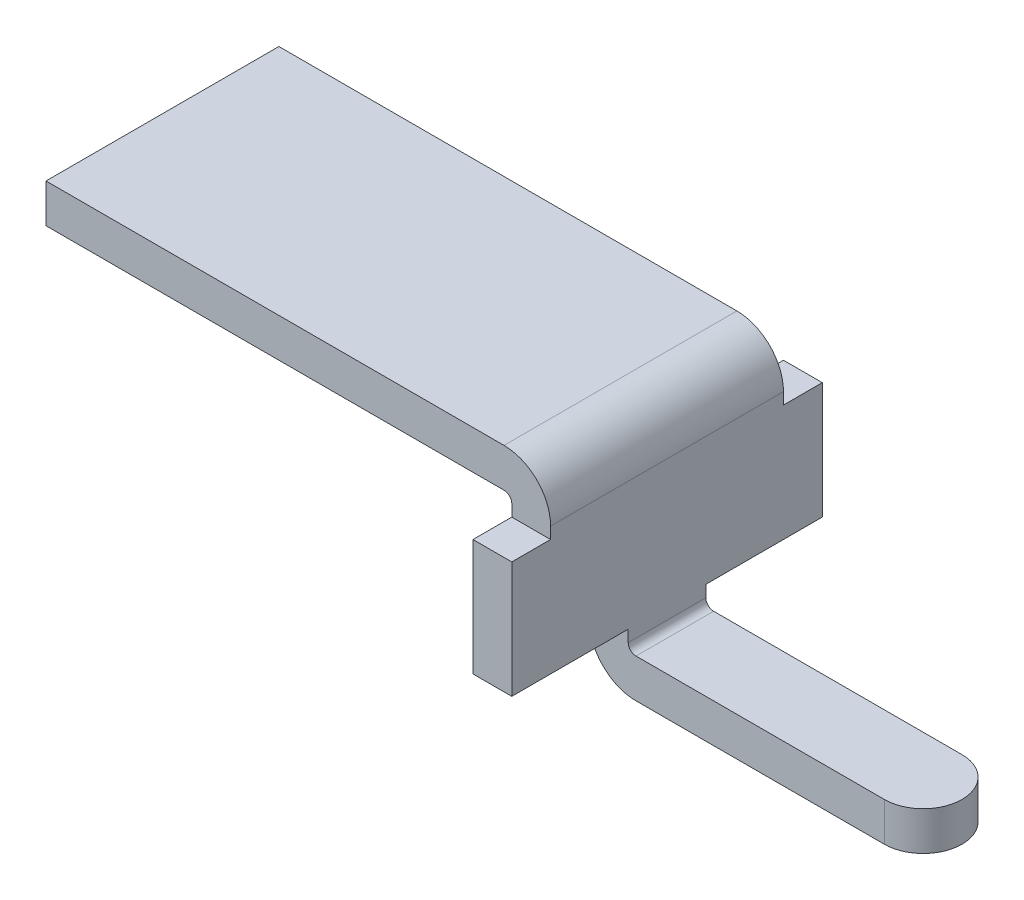
ISO-10303-21;
HEADER;
FILE_DESCRIPTION(('STEP AP214'),'2;1');
FILE_NAME('part.step','',(''),(''),'','','');
FILE_SCHEMA(('AUTOMOTIVE_DESIGN { 1 0 10303 214 1 1 1 1 }'));
ENDSEC;
DATA;
#1=APPLICATION_CONTEXT('core data for automotive mechanical design processes');
#2=APPLICATION_PROTOCOL_DEFINITION('international standard','automotive_design',2000,#1);
#3=PRODUCT_CONTEXT('',#1,'mechanical');
#4=PRODUCT('Part','Part','',(#3));
#5=PRODUCT_RELATED_PRODUCT_CATEGORY('part','',(#4));
#6=PRODUCT_DEFINITION_FORMATION('','',#4);
#7=PRODUCT_DEFINITION_CONTEXT('part definition',#1,'design');
#8=PRODUCT_DEFINITION('design','',#6,#7);
#9=PRODUCT_DEFINITION_SHAPE('','',#8);
#10=(LENGTH_UNIT() NAMED_UNIT(*) SI_UNIT(.MILLI.,.METRE.));
#11=(NAMED_UNIT(*) PLANE_ANGLE_UNIT() SI_UNIT($,.RADIAN.));
#12=(NAMED_UNIT(*) SI_UNIT($,.STERADIAN.) SOLID_ANGLE_UNIT());
#13=UNCERTAINTY_MEASURE_WITH_UNIT(LENGTH_MEASURE(1.E-05),#10,'distance_accuracy_value','');
#14=(GEOMETRIC_REPRESENTATION_CONTEXT(3) GLOBAL_UNCERTAINTY_ASSIGNED_CONTEXT((#13)) GLOBAL_UNIT_ASSIGNED_CONTEXT((#10,
#11,#12)) REPRESENTATION_CONTEXT('',''));
#15=CARTESIAN_POINT('',(0.,0.,0.));
#16=DIRECTION('',(0.,0.,1.));
#17=DIRECTION('',(1.,0.,0.));
#18=AXIS2_PLACEMENT_3D('',#15,#16,#17);
#19=CARTESIAN_POINT('',(6.,-2.5,8.24309069156733));
#20=DIRECTION('',(0.,-1.,0.));
#21=DIRECTION('',(0.,0.,-1.));
#22=AXIS2_PLACEMENT_3D('',#19,#20,#21);
#23=PLANE('',#22);
#24=DIRECTION('',(0.,0.,-1.));
#25=VECTOR('',#24,1.);
#26=CARTESIAN_POINT('',(6.6,-2.5,8.24309069156733));
#27=LINE('',#26,#25);
#28=CARTESIAN_POINT('',(6.6,-2.5,2.));
#29=VERTEX_POINT('',#28);
#30=CARTESIAN_POINT('',(6.6,-2.5,0.999999999999999));
#31=VERTEX_POINT('',#30);
#32=EDGE_CURVE('E298',#29,#31,#27,.T.);
#33=ORIENTED_EDGE('',*,*,#32,.T.);
#34=DIRECTION('',(1.,0.,0.));
#35=VECTOR('',#34,1.);
#36=CARTESIAN_POINT('',(10.3,-2.5,1.));
#37=LINE('',#36,#35);
#38=CARTESIAN_POINT('',(9.8,-2.5,1.));
#39=VERTEX_POINT('',#38);
#40=EDGE_CURVE('E263',#31,#39,#37,.T.);
#41=ORIENTED_EDGE('',*,*,#40,.T.);
#42=CARTESIAN_POINT('',(9.8,-2.5,1.5));
#43=DIRECTION('',(0.,1.,0.));
#44=DIRECTION('',(0.,0.,1.));
#45=AXIS2_PLACEMENT_3D('',#42,#43,#44);
#46=CIRCLE('',#45,0.5);
#47=CARTESIAN_POINT('',(9.8,-2.5,2.));
#48=VERTEX_POINT('',#47);
#49=EDGE_CURVE('E287',#48,#39,#46,.T.);
#50=ORIENTED_EDGE('',*,*,#49,.F.);
#51=DIRECTION('',(-1.,0.,0.));
#52=VECTOR('',#51,1.);
#53=CARTESIAN_POINT('',(10.3,-2.5,2.));
#54=LINE('',#53,#52);
#55=EDGE_CURVE('E288',#48,#29,#54,.T.);
#56=ORIENTED_EDGE('',*,*,#55,.T.);
#57=EDGE_LOOP('',(#33,#41,#50,#56));
#58=FACE_BOUND('',#57,.T.);
#59=ADVANCED_FACE('F16',(#58),#23,.T.);
#60=CARTESIAN_POINT('',(10.3,2.66474801092882,2.));
#61=DIRECTION('',(0.,0.,-1.));
#62=DIRECTION('',(-1.,0.,0.));
#63=AXIS2_PLACEMENT_3D('',#60,#61,#62);
#64=PLANE('',#63);
#65=DIRECTION('',(0.,1.,0.));
#66=VECTOR('',#65,1.);
#67=CARTESIAN_POINT('',(9.8,-2.5,2.));
#68=LINE('',#67,#66);
#69=CARTESIAN_POINT('',(9.8,-2.,2.));
#70=VERTEX_POINT('',#69);
#71=EDGE_CURVE('E284',#70,#48,#68,.F.);
#72=ORIENTED_EDGE('',*,*,#71,.F.);
#73=DIRECTION('',(-1.,0.,0.));
#74=VECTOR('',#73,1.);
#75=CARTESIAN_POINT('',(6.5,-2.,2.));
#76=LINE('',#75,#74);
#77=CARTESIAN_POINT('',(6.6,-2.,2.));
#78=VERTEX_POINT('',#77);
#79=EDGE_CURVE('E251',#78,#70,#76,.F.);
#80=ORIENTED_EDGE('',*,*,#79,.F.);
#81=CARTESIAN_POINT('',(6.6,-1.9,2.));
#82=DIRECTION('',(0.,0.,1.));
#83=DIRECTION('',(1.,0.,0.));
#84=AXIS2_PLACEMENT_3D('',#81,#82,#83);
#85=CIRCLE('',#84,0.1);
#86=CARTESIAN_POINT('',(6.5,-1.9,2.));
#87=VERTEX_POINT('',#86);
#88=EDGE_CURVE('E19',#87,#78,#85,.T.);
#89=ORIENTED_EDGE('',*,*,#88,.F.);
#90=DIRECTION('',(0.,1.,0.));
#91=VECTOR('',#90,1.);
#92=CARTESIAN_POINT('',(6.5,2.66474801092882,2.));
#93=LINE('',#92,#91);
#94=CARTESIAN_POINT('',(6.5,-1.75,2.));
#95=VERTEX_POINT('',#94);
#96=EDGE_CURVE('E108',#95,#87,#93,.F.);
#97=ORIENTED_EDGE('',*,*,#96,.F.);
#98=DIRECTION('',(-1.,0.,0.));
#99=VECTOR('',#98,1.);
#100=CARTESIAN_POINT('',(10.3,-1.75,2.));
#101=LINE('',#100,#99);
#102=CARTESIAN_POINT('',(6.,-1.75,2.));
#103=VERTEX_POINT('',#102);
#104=EDGE_CURVE('E292',#103,#95,#101,.F.);
#105=ORIENTED_EDGE('',*,*,#104,.F.);
#106=DIRECTION('',(0.,1.,0.));
#107=VECTOR('',#106,1.);
#108=CARTESIAN_POINT('',(6.,2.66474801092882,2.));
#109=LINE('',#108,#107);
#110=CARTESIAN_POINT('',(6.,-1.9,2.));
#111=VERTEX_POINT('',#110);
#112=EDGE_CURVE('E295',#111,#103,#109,.T.);
#113=ORIENTED_EDGE('',*,*,#112,.F.);
#114=CARTESIAN_POINT('',(6.6,-1.9,2.));
#115=DIRECTION('',(0.,0.,-1.));
#116=DIRECTION('',(-1.,0.,0.));
#117=AXIS2_PLACEMENT_3D('',#114,#115,#116);
#118=CIRCLE('',#117,0.6);
#119=EDGE_CURVE('E280',#29,#111,#118,.T.);
#120=ORIENTED_EDGE('',*,*,#119,.F.);
#121=ORIENTED_EDGE('',*,*,#55,.F.);
#122=EDGE_LOOP('',(#72,#80,#89,#97,#105,#113,#120,#121));
#123=FACE_BOUND('',#122,.T.);
#124=ADVANCED_FACE('F364',(#123),#64,.F.);
#125=CARTESIAN_POINT('',(9.8,2.66474801092882,1.5));
#126=DIRECTION('',(0.,1.,0.));
#127=DIRECTION('',(0.,0.,1.));
#128=AXIS2_PLACEMENT_3D('',#125,#126,#127);
#129=CYLINDRICAL_SURFACE('',#128,0.5);
#130=CARTESIAN_POINT('',(9.8,-2.,1.5));
#131=DIRECTION('',(0.,1.,0.));
#132=DIRECTION('',(0.,0.,1.));
#133=AXIS2_PLACEMENT_3D('',#130,#131,#132);
#134=CIRCLE('',#133,0.5);
#135=CARTESIAN_POINT('',(9.8,-2.,1.));
#136=VERTEX_POINT('',#135);
#137=EDGE_CURVE('E250',#70,#136,#134,.T.);
#138=ORIENTED_EDGE('',*,*,#137,.F.);
#139=ORIENTED_EDGE('',*,*,#71,.T.);
#140=ORIENTED_EDGE('',*,*,#49,.T.);
#141=DIRECTION('',(0.,1.,0.));
#142=VECTOR('',#141,1.);
#143=CARTESIAN_POINT('',(9.8,2.66474801092882,1.));
#144=LINE('',#143,#142);
#145=EDGE_CURVE('E266',#39,#136,#144,.T.);
#146=ORIENTED_EDGE('',*,*,#145,.T.);
#147=EDGE_LOOP('',(#138,#139,#140,#146));
#148=FACE_BOUND('',#147,.T.);
#149=ADVANCED_FACE('F338',(#148),#129,.T.);
#150=CARTESIAN_POINT('',(10.3,2.66474801092882,1.));
#151=DIRECTION('',(0.,0.,1.));
#152=DIRECTION('',(1.,0.,0.));
#153=AXIS2_PLACEMENT_3D('',#150,#151,#152);
#154=PLANE('',#153);
#155=ORIENTED_EDGE('',*,*,#145,.F.);
#156=ORIENTED_EDGE('',*,*,#40,.F.);
#157=CARTESIAN_POINT('',(6.6,-1.9,0.999999999999999));
#158=DIRECTION('',(0.,0.,-1.));
#159=DIRECTION('',(-1.,0.,0.));
#160=AXIS2_PLACEMENT_3D('',#157,#158,#159);
#161=CIRCLE('',#160,0.6);
#162=CARTESIAN_POINT('',(6.,-1.9,0.999999999999999));
#163=VERTEX_POINT('',#162);
#164=EDGE_CURVE('E254',#163,#31,#161,.F.);
#165=ORIENTED_EDGE('',*,*,#164,.F.);
#166=DIRECTION('',(0.,1.,0.));
#167=VECTOR('',#166,1.);
#168=CARTESIAN_POINT('',(6.,2.66474801092882,0.999999999999999));
#169=LINE('',#168,#167);
#170=CARTESIAN_POINT('',(6.,-1.75,0.999999999999999));
#171=VERTEX_POINT('',#170);
#172=EDGE_CURVE('E267',#171,#163,#169,.F.);
#173=ORIENTED_EDGE('',*,*,#172,.F.);
#174=DIRECTION('',(1.,0.,0.));
#175=VECTOR('',#174,1.);
#176=CARTESIAN_POINT('',(10.3,-1.75,1.));
#177=LINE('',#176,#175);
#178=CARTESIAN_POINT('',(6.5,-1.75,0.999999999999999));
#179=VERTEX_POINT('',#178);
#180=EDGE_CURVE('E269',#179,#171,#177,.F.);
#181=ORIENTED_EDGE('',*,*,#180,.F.);
#182=DIRECTION('',(0.,1.,0.));
#183=VECTOR('',#182,1.);
#184=CARTESIAN_POINT('',(6.5,2.66474801092882,0.999999999999999));
#185=LINE('',#184,#183);
#186=CARTESIAN_POINT('',(6.5,-1.9,0.999999999999999));
#187=VERTEX_POINT('',#186);
#188=EDGE_CURVE('E272',#187,#179,#185,.T.);
#189=ORIENTED_EDGE('',*,*,#188,.F.);
#190=CARTESIAN_POINT('',(6.6,-1.9,0.999999999999999));
#191=DIRECTION('',(0.,0.,1.));
#192=DIRECTION('',(1.,0.,0.));
#193=AXIS2_PLACEMENT_3D('',#190,#191,#192);
#194=CIRCLE('',#193,0.1);
#195=CARTESIAN_POINT('',(6.6,-2.,0.999999999999999));
#196=VERTEX_POINT('',#195);
#197=EDGE_CURVE('E275',#196,#187,#194,.F.);
#198=ORIENTED_EDGE('',*,*,#197,.F.);
#199=DIRECTION('',(-1.,0.,0.));
#200=VECTOR('',#199,1.);
#201=CARTESIAN_POINT('',(6.5,-2.,0.999999999999999));
#202=LINE('',#201,#200);
#203=EDGE_CURVE('E247',#136,#196,#202,.T.);
#204=ORIENTED_EDGE('',*,*,#203,.F.);
#205=EDGE_LOOP('',(#155,#156,#165,#173,#181,#189,#198,#204));
#206=FACE_BOUND('',#205,.T.);
#207=ADVANCED_FACE('F345',(#206),#154,.F.);
#208=CARTESIAN_POINT('',(6.6,-1.9,8.24309069156733));
#209=DIRECTION('',(0.,0.,-1.));
#210=DIRECTION('',(-1.,0.,0.));
#211=AXIS2_PLACEMENT_3D('',#208,#209,#210);
#212=CYLINDRICAL_SURFACE('',#211,0.6);
#213=ORIENTED_EDGE('',*,*,#164,.T.);
#214=ORIENTED_EDGE('',*,*,#32,.F.);
#215=ORIENTED_EDGE('',*,*,#119,.T.);
#216=DIRECTION('',(0.,0.,1.));
#217=VECTOR('',#216,1.);
#218=CARTESIAN_POINT('',(6.,-1.9,8.24309069156733));
#219=LINE('',#218,#217);
#220=EDGE_CURVE('E244',#163,#111,#219,.T.);
#221=ORIENTED_EDGE('',*,*,#220,.F.);
#222=EDGE_LOOP('',(#213,#214,#215,#221));
#223=FACE_BOUND('',#222,.T.);
#224=ADVANCED_FACE('F349',(#223),#212,.T.);
#225=CARTESIAN_POINT('',(6.5,-2.,8.24309069156733));
#226=DIRECTION('',(0.,1.,0.));
#227=DIRECTION('',(-1.,0.,0.));
#228=AXIS2_PLACEMENT_3D('',#225,#226,#227);
#229=PLANE('',#228);
#230=ORIENTED_EDGE('',*,*,#203,.T.);
#231=DIRECTION('',(0.,0.,1.));
#232=VECTOR('',#231,1.);
#233=CARTESIAN_POINT('',(6.6,-2.,8.24309069156733));
#234=LINE('',#233,#232);
#235=EDGE_CURVE('E240',#196,#78,#234,.T.);
#236=ORIENTED_EDGE('',*,*,#235,.T.);
#237=ORIENTED_EDGE('',*,*,#79,.T.);
#238=ORIENTED_EDGE('',*,*,#137,.T.);
#239=EDGE_LOOP('',(#230,#236,#237,#238));
#240=FACE_BOUND('',#239,.T.);
#241=ADVANCED_FACE('F362',(#240),#229,.T.);
#242=CARTESIAN_POINT('',(6.,0.5,8.24309069156733));
#243=DIRECTION('',(-1.,0.,0.));
#244=DIRECTION('',(0.,0.,1.));
#245=AXIS2_PLACEMENT_3D('',#242,#243,#244);
#246=PLANE('',#245);
#247=ORIENTED_EDGE('',*,*,#172,.T.);
#248=ORIENTED_EDGE('',*,*,#220,.T.);
#249=ORIENTED_EDGE('',*,*,#112,.T.);
#250=DIRECTION('',(0.,0.,1.));
#251=VECTOR('',#250,1.);
#252=CARTESIAN_POINT('',(6.,-1.75,3.5));
#253=LINE('',#252,#251);
#254=CARTESIAN_POINT('',(6.,-1.75,3.5));
#255=VERTEX_POINT('',#254);
#256=EDGE_CURVE('E283',#103,#255,#253,.T.);
#257=ORIENTED_EDGE('',*,*,#256,.T.);
#258=DIRECTION('',(0.,1.,0.));
#259=VECTOR('',#258,1.);
#260=CARTESIAN_POINT('',(6.,0.,3.5));
#261=LINE('',#260,#259);
#262=CARTESIAN_POINT('',(6.,-0.250000000000001,3.5));
#263=VERTEX_POINT('',#262);
#264=EDGE_CURVE('E213',#263,#255,#261,.F.);
#265=ORIENTED_EDGE('',*,*,#264,.F.);
#266=DIRECTION('',(0.,0.,1.));
#267=VECTOR('',#266,1.);
#268=CARTESIAN_POINT('',(6.,-0.250000000000001,8.24309069156733));
#269=LINE('',#268,#267);
#270=CARTESIAN_POINT('',(6.,-0.250000000000001,3.));
#271=VERTEX_POINT('',#270);
#272=EDGE_CURVE('E163',#263,#271,#269,.F.);
#273=ORIENTED_EDGE('',*,*,#272,.T.);
#274=DIRECTION('',(0.,1.,0.));
#275=VECTOR('',#274,1.);
#276=CARTESIAN_POINT('',(6.,0.5,3.));
#277=LINE('',#276,#275);
#278=CARTESIAN_POINT('',(6.,-0.1,3.));
#279=VERTEX_POINT('',#278);
#280=EDGE_CURVE('E229',#271,#279,#277,.T.);
#281=ORIENTED_EDGE('',*,*,#280,.T.);
#282=DIRECTION('',(0.,0.,-1.));
#283=VECTOR('',#282,1.);
#284=CARTESIAN_POINT('',(6.,-0.1,8.24309069156733));
#285=LINE('',#284,#283);
#286=CARTESIAN_POINT('',(6.,-0.1,0.));
#287=VERTEX_POINT('',#286);
#288=EDGE_CURVE('E166',#279,#287,#285,.T.);
#289=ORIENTED_EDGE('',*,*,#288,.T.);
#290=DIRECTION('',(0.,1.,0.));
#291=VECTOR('',#290,1.);
#292=CARTESIAN_POINT('',(6.,0.5,0.));
#293=LINE('',#292,#291);
#294=CARTESIAN_POINT('',(6.,-0.250000000000001,0.));
#295=VERTEX_POINT('',#294);
#296=EDGE_CURVE('E231',#287,#295,#293,.F.);
#297=ORIENTED_EDGE('',*,*,#296,.T.);
#298=DIRECTION('',(0.,0.,1.));
#299=VECTOR('',#298,1.);
#300=CARTESIAN_POINT('',(6.,-0.250000000000001,8.24309069156733));
#301=LINE('',#300,#299);
#302=CARTESIAN_POINT('',(6.,-0.250000000000001,-0.5));
#303=VERTEX_POINT('',#302);
#304=EDGE_CURVE('E235',#295,#303,#301,.F.);
#305=ORIENTED_EDGE('',*,*,#304,.T.);
#306=DIRECTION('',(0.,1.,0.));
#307=VECTOR('',#306,1.);
#308=CARTESIAN_POINT('',(6.,0.,-0.5));
#309=LINE('',#308,#307);
#310=CARTESIAN_POINT('',(6.,-1.75,-0.5));
#311=VERTEX_POINT('',#310);
#312=EDGE_CURVE('E214',#303,#311,#309,.F.);
#313=ORIENTED_EDGE('',*,*,#312,.T.);
#314=DIRECTION('',(0.,0.,1.));
#315=VECTOR('',#314,1.);
#316=CARTESIAN_POINT('',(6.,-1.75,-0.5));
#317=LINE('',#316,#315);
#318=EDGE_CURVE('E223',#311,#171,#317,.T.);
#319=ORIENTED_EDGE('',*,*,#318,.T.);
#320=EDGE_LOOP('',(#247,#248,#249,#257,#265,#273,#281,#289,#297,#305,#313,#319));
#321=FACE_BOUND('',#320,.T.);
#322=ADVANCED_FACE('F353',(#321),#246,.T.);
#323=CARTESIAN_POINT('',(6.,-1.75,3.5));
#324=DIRECTION('',(0.,1.,0.));
#325=DIRECTION('',(0.,0.,1.));
#326=AXIS2_PLACEMENT_3D('',#323,#324,#325);
#327=PLANE('',#326);
#328=ORIENTED_EDGE('',*,*,#104,.T.);
#329=DIRECTION('',(0.,0.,-1.));
#330=VECTOR('',#329,1.);
#331=CARTESIAN_POINT('',(6.5,-1.75,8.24309069156733));
#332=LINE('',#331,#330);
#333=CARTESIAN_POINT('',(6.5,-1.75,3.5));
#334=VERTEX_POINT('',#333);
#335=EDGE_CURVE('E200',#334,#95,#332,.T.);
#336=ORIENTED_EDGE('',*,*,#335,.F.);
#337=DIRECTION('',(1.,0.,0.));
#338=VECTOR('',#337,1.);
#339=CARTESIAN_POINT('',(0.,-1.75,3.5));
#340=LINE('',#339,#338);
#341=EDGE_CURVE('E167',#255,#334,#340,.T.);
#342=ORIENTED_EDGE('',*,*,#341,.F.);
#343=ORIENTED_EDGE('',*,*,#256,.F.);
#344=EDGE_LOOP('',(#328,#336,#342,#343));
#345=FACE_BOUND('',#344,.T.);
#346=ADVANCED_FACE('F367',(#345),#327,.F.);
#347=CARTESIAN_POINT('',(6.6,-1.9,8.24309069156733));
#348=DIRECTION('',(0.,0.,1.));
#349=DIRECTION('',(1.,0.,0.));
#350=AXIS2_PLACEMENT_3D('',#347,#348,#349);
#351=CYLINDRICAL_SURFACE('',#350,0.1);
#352=ORIENTED_EDGE('',*,*,#88,.T.);
#353=ORIENTED_EDGE('',*,*,#235,.F.);
#354=ORIENTED_EDGE('',*,*,#197,.T.);
#355=DIRECTION('',(0.,0.,-1.));
#356=VECTOR('',#355,1.);
#357=CARTESIAN_POINT('',(6.5,-1.9,8.24309069156733));
#358=LINE('',#357,#356);
#359=EDGE_CURVE('E218',#87,#187,#358,.T.);
#360=ORIENTED_EDGE('',*,*,#359,.F.);
#361=EDGE_LOOP('',(#352,#353,#354,#360));
#362=FACE_BOUND('',#361,.T.);
#363=ADVANCED_FACE('F363',(#362),#351,.F.);
#364=CARTESIAN_POINT('',(6.5,-1.75,-0.5));
#365=DIRECTION('',(0.,1.,0.));
#366=DIRECTION('',(0.,0.,1.));
#367=AXIS2_PLACEMENT_3D('',#364,#365,#366);
#368=PLANE('',#367);
#369=ORIENTED_EDGE('',*,*,#180,.T.);
#370=ORIENTED_EDGE('',*,*,#318,.F.);
#371=DIRECTION('',(1.,0.,0.));
#372=VECTOR('',#371,1.);
#373=CARTESIAN_POINT('',(0.,-1.75,-0.5));
#374=LINE('',#373,#372);
#375=CARTESIAN_POINT('',(6.5,-1.75,-0.5));
#376=VERTEX_POINT('',#375);
#377=EDGE_CURVE('E210',#311,#376,#374,.T.);
#378=ORIENTED_EDGE('',*,*,#377,.T.);
#379=DIRECTION('',(0.,0.,-1.));
#380=VECTOR('',#379,1.);
#381=CARTESIAN_POINT('',(6.5,-1.75,8.24309069156733));
#382=LINE('',#381,#380);
#383=EDGE_CURVE('E207',#179,#376,#382,.T.);
#384=ORIENTED_EDGE('',*,*,#383,.F.);
#385=EDGE_LOOP('',(#369,#370,#378,#384));
#386=FACE_BOUND('',#385,.T.);
#387=ADVANCED_FACE('F357',(#386),#368,.F.);
#388=CARTESIAN_POINT('',(0.,0.,-0.5));
#389=DIRECTION('',(0.,0.,1.));
#390=DIRECTION('',(1.,0.,0.));
#391=AXIS2_PLACEMENT_3D('',#388,#389,#390);
#392=PLANE('',#391);
#393=ORIENTED_EDGE('',*,*,#377,.F.);
#394=ORIENTED_EDGE('',*,*,#312,.F.);
#395=DIRECTION('',(1.,0.,0.));
#396=VECTOR('',#395,1.);
#397=CARTESIAN_POINT('',(6.5,-0.250000000000001,-0.5));
#398=LINE('',#397,#396);
#399=CARTESIAN_POINT('',(6.5,-0.250000000000001,-0.5));
#400=VERTEX_POINT('',#399);
#401=EDGE_CURVE('E197',#303,#400,#398,.T.);
#402=ORIENTED_EDGE('',*,*,#401,.T.);
#403=DIRECTION('',(0.,1.,0.));
#404=VECTOR('',#403,1.);
#405=CARTESIAN_POINT('',(6.5,0.5,-0.5));
#406=LINE('',#405,#404);
#407=EDGE_CURVE('E204',#376,#400,#406,.T.);
#408=ORIENTED_EDGE('',*,*,#407,.F.);
#409=EDGE_LOOP('',(#393,#394,#402,#408));
#410=FACE_BOUND('',#409,.T.);
#411=ADVANCED_FACE('F418',(#410),#392,.F.);
#412=CARTESIAN_POINT('',(0.,0.,3.5));
#413=DIRECTION('',(0.,0.,1.));
#414=DIRECTION('',(1.,0.,0.));
#415=AXIS2_PLACEMENT_3D('',#412,#413,#414);
#416=PLANE('',#415);
#417=DIRECTION('',(0.,1.,0.));
#418=VECTOR('',#417,1.);
#419=CARTESIAN_POINT('',(6.5,0.5,3.5));
#420=LINE('',#419,#418);
#421=CARTESIAN_POINT('',(6.5,-0.250000000000001,3.5));
#422=VERTEX_POINT('',#421);
#423=EDGE_CURVE('E170',#422,#334,#420,.F.);
#424=ORIENTED_EDGE('',*,*,#423,.F.);
#425=DIRECTION('',(1.,0.,0.));
#426=VECTOR('',#425,1.);
#427=CARTESIAN_POINT('',(0.,-0.250000000000001,3.5));
#428=LINE('',#427,#426);
#429=EDGE_CURVE('E156',#422,#263,#428,.F.);
#430=ORIENTED_EDGE('',*,*,#429,.T.);
#431=ORIENTED_EDGE('',*,*,#264,.T.);
#432=ORIENTED_EDGE('',*,*,#341,.T.);
#433=EDGE_LOOP('',(#424,#430,#431,#432));
#434=FACE_BOUND('',#433,.T.);
#435=ADVANCED_FACE('F171',(#434),#416,.T.);
#436=CARTESIAN_POINT('',(5.9,-0.1,8.24309069156733));
#437=DIRECTION('',(0.,0.,-1.));
#438=DIRECTION('',(-1.,0.,0.));
#439=AXIS2_PLACEMENT_3D('',#436,#437,#438);
#440=CYLINDRICAL_SURFACE('',#439,0.1);
#441=DIRECTION('',(0.,0.,1.));
#442=VECTOR('',#441,1.);
#443=CARTESIAN_POINT('',(5.9,0.,3.));
#444=LINE('',#443,#442);
#445=CARTESIAN_POINT('',(5.9,0.,3.));
#446=VERTEX_POINT('',#445);
#447=CARTESIAN_POINT('',(5.9,0.,0.));
#448=VERTEX_POINT('',#447);
#449=EDGE_CURVE('E175',#446,#448,#444,.F.);
#450=ORIENTED_EDGE('',*,*,#449,.T.);
#451=CARTESIAN_POINT('',(5.9,-0.1,0.));
#452=DIRECTION('',(0.,0.,-1.));
#453=DIRECTION('',(-1.,0.,0.));
#454=AXIS2_PLACEMENT_3D('',#451,#452,#453);
#455=CIRCLE('',#454,0.1);
#456=EDGE_CURVE('E228',#287,#448,#455,.F.);
#457=ORIENTED_EDGE('',*,*,#456,.F.);
#458=ORIENTED_EDGE('',*,*,#288,.F.);
#459=CARTESIAN_POINT('',(5.9,-0.1,3.));
#460=DIRECTION('',(0.,0.,-1.));
#461=DIRECTION('',(-1.,0.,0.));
#462=AXIS2_PLACEMENT_3D('',#459,#460,#461);
#463=CIRCLE('',#462,0.1);
#464=EDGE_CURVE('E201',#446,#279,#463,.T.);
#465=ORIENTED_EDGE('',*,*,#464,.F.);
#466=EDGE_LOOP('',(#450,#457,#458,#465));
#467=FACE_BOUND('',#466,.T.);
#468=ADVANCED_FACE('F411',(#467),#440,.F.);
#469=CARTESIAN_POINT('',(6.5,-0.250000000000001,-0.5));
#470=DIRECTION('',(0.,-1.,0.));
#471=DIRECTION('',(0.,0.,-1.));
#472=AXIS2_PLACEMENT_3D('',#469,#470,#471);
#473=PLANE('',#472);
#474=DIRECTION('',(0.,0.,-1.));
#475=VECTOR('',#474,1.);
#476=CARTESIAN_POINT('',(6.5,-0.250000000000001,8.24309069156733));
#477=LINE('',#476,#475);
#478=CARTESIAN_POINT('',(6.5,-0.250000000000001,0.));
#479=VERTEX_POINT('',#478);
#480=EDGE_CURVE('E206',#400,#479,#477,.F.);
#481=ORIENTED_EDGE('',*,*,#480,.F.);
#482=ORIENTED_EDGE('',*,*,#401,.F.);
#483=ORIENTED_EDGE('',*,*,#304,.F.);
#484=DIRECTION('',(-1.,0.,0.));
#485=VECTOR('',#484,1.);
#486=CARTESIAN_POINT('',(0.,-0.250000000000001,0.));
#487=LINE('',#486,#485);
#488=EDGE_CURVE('E183',#479,#295,#487,.T.);
#489=ORIENTED_EDGE('',*,*,#488,.F.);
#490=EDGE_LOOP('',(#481,#482,#483,#489));
#491=FACE_BOUND('',#490,.T.);
#492=ADVANCED_FACE('F408',(#491),#473,.F.);
#493=CARTESIAN_POINT('',(6.5,0.5,8.24309069156733));
#494=DIRECTION('',(1.,0.,0.));
#495=DIRECTION('',(0.,0.,-1.));
#496=AXIS2_PLACEMENT_3D('',#493,#494,#495);
#497=PLANE('',#496);
#498=DIRECTION('',(0.,0.,-1.));
#499=VECTOR('',#498,1.);
#500=CARTESIAN_POINT('',(6.5,-0.250000000000001,3.5));
#501=LINE('',#500,#499);
#502=CARTESIAN_POINT('',(6.5,-0.250000000000001,3.));
#503=VERTEX_POINT('',#502);
#504=EDGE_CURVE('E161',#503,#422,#501,.F.);
#505=ORIENTED_EDGE('',*,*,#504,.T.);
#506=ORIENTED_EDGE('',*,*,#423,.T.);
#507=ORIENTED_EDGE('',*,*,#335,.T.);
#508=ORIENTED_EDGE('',*,*,#96,.T.);
#509=ORIENTED_EDGE('',*,*,#359,.T.);
#510=ORIENTED_EDGE('',*,*,#188,.T.);
#511=ORIENTED_EDGE('',*,*,#383,.T.);
#512=ORIENTED_EDGE('',*,*,#407,.T.);
#513=ORIENTED_EDGE('',*,*,#480,.T.);
#514=DIRECTION('',(0.,1.,0.));
#515=VECTOR('',#514,1.);
#516=CARTESIAN_POINT('',(6.5,0.,0.));
#517=LINE('',#516,#515);
#518=CARTESIAN_POINT('',(6.5,-0.0999999999999999,0.));
#519=VERTEX_POINT('',#518);
#520=EDGE_CURVE('E603',#519,#479,#517,.F.);
#521=ORIENTED_EDGE('',*,*,#520,.F.);
#522=DIRECTION('',(0.,0.,1.));
#523=VECTOR('',#522,1.);
#524=CARTESIAN_POINT('',(6.5,-0.0999999999999999,3.));
#525=LINE('',#524,#523);
#526=CARTESIAN_POINT('',(6.5,-0.0999999999999999,3.));
#527=VERTEX_POINT('',#526);
#528=EDGE_CURVE('E326',#527,#519,#525,.F.);
#529=ORIENTED_EDGE('',*,*,#528,.F.);
#530=DIRECTION('',(0.,1.,0.));
#531=VECTOR('',#530,1.);
#532=CARTESIAN_POINT('',(6.5,0.5,3.));
#533=LINE('',#532,#531);
#534=EDGE_CURVE('E176',#527,#503,#533,.F.);
#535=ORIENTED_EDGE('',*,*,#534,.T.);
#536=EDGE_LOOP('',(#505,#506,#507,#508,#509,#510,#511,#512,#513,#521,#529,#535));
#537=FACE_BOUND('',#536,.T.);
#538=ADVANCED_FACE('F178',(#537),#497,.T.);
#539=CARTESIAN_POINT('',(0.,0.,3.));
#540=DIRECTION('',(0.,1.,0.));
#541=DIRECTION('',(0.,0.,1.));
#542=AXIS2_PLACEMENT_3D('',#539,#540,#541);
#543=PLANE('',#542);
#544=ORIENTED_EDGE('',*,*,#449,.F.);
#545=DIRECTION('',(-1.,0.,0.));
#546=VECTOR('',#545,1.);
#547=CARTESIAN_POINT('',(0.,0.,3.));
#548=LINE('',#547,#546);
#549=CARTESIAN_POINT('',(0.,0.,3.));
#550=VERTEX_POINT('',#549);
#551=EDGE_CURVE('E325',#446,#550,#548,.T.);
#552=ORIENTED_EDGE('',*,*,#551,.T.);
#553=DIRECTION('',(0.,0.,-1.));
#554=VECTOR('',#553,1.);
#555=CARTESIAN_POINT('',(0.,0.,3.));
#556=LINE('',#555,#554);
#557=CARTESIAN_POINT('',(0.,0.,0.));
#558=VERTEX_POINT('',#557);
#559=EDGE_CURVE('E180',#550,#558,#556,.T.);
#560=ORIENTED_EDGE('',*,*,#559,.T.);
#561=DIRECTION('',(-1.,0.,0.));
#562=VECTOR('',#561,1.);
#563=CARTESIAN_POINT('',(0.,0.,0.));
#564=LINE('',#563,#562);
#565=EDGE_CURVE('E612',#448,#558,#564,.T.);
#566=ORIENTED_EDGE('',*,*,#565,.F.);
#567=EDGE_LOOP('',(#544,#552,#560,#566));
#568=FACE_BOUND('',#567,.T.);
#569=ADVANCED_FACE('F402',(#568),#543,.F.);
#570=CARTESIAN_POINT('',(6.,-0.250000000000001,3.5));
#571=DIRECTION('',(0.,-1.,0.));
#572=DIRECTION('',(0.,0.,-1.));
#573=AXIS2_PLACEMENT_3D('',#570,#571,#572);
#574=PLANE('',#573);
#575=ORIENTED_EDGE('',*,*,#272,.F.);
#576=ORIENTED_EDGE('',*,*,#429,.F.);
#577=ORIENTED_EDGE('',*,*,#504,.F.);
#578=DIRECTION('',(-1.,0.,0.));
#579=VECTOR('',#578,1.);
#580=CARTESIAN_POINT('',(0.,-0.250000000000001,3.));
#581=LINE('',#580,#579);
#582=EDGE_CURVE('E192',#503,#271,#581,.T.);
#583=ORIENTED_EDGE('',*,*,#582,.T.);
#584=EDGE_LOOP('',(#575,#576,#577,#583));
#585=FACE_BOUND('',#584,.T.);
#586=ADVANCED_FACE('F158',(#585),#574,.F.);
#587=CARTESIAN_POINT('',(0.,0.,3.));
#588=DIRECTION('',(1.,0.,0.));
#589=DIRECTION('',(0.,0.,-1.));
#590=AXIS2_PLACEMENT_3D('',#587,#588,#589);
#591=PLANE('',#590);
#592=ORIENTED_EDGE('',*,*,#559,.F.);
#593=DIRECTION('',(0.,1.,0.));
#594=VECTOR('',#593,1.);
#595=CARTESIAN_POINT('',(0.,0.,3.));
#596=LINE('',#595,#594);
#597=CARTESIAN_POINT('',(0.,0.5,3.));
#598=VERTEX_POINT('',#597);
#599=EDGE_CURVE('E322',#550,#598,#596,.T.);
#600=ORIENTED_EDGE('',*,*,#599,.T.);
#601=DIRECTION('',(0.,0.,-1.));
#602=VECTOR('',#601,1.);
#603=CARTESIAN_POINT('',(0.,0.5,3.));
#604=LINE('',#603,#602);
#605=CARTESIAN_POINT('',(0.,0.5,0.));
#606=VERTEX_POINT('',#605);
#607=EDGE_CURVE('E194',#598,#606,#604,.T.);
#608=ORIENTED_EDGE('',*,*,#607,.T.);
#609=DIRECTION('',(0.,1.,0.));
#610=VECTOR('',#609,1.);
#611=CARTESIAN_POINT('',(0.,0.,0.));
#612=LINE('',#611,#610);
#613=EDGE_CURVE('E610',#558,#606,#612,.T.);
#614=ORIENTED_EDGE('',*,*,#613,.F.);
#615=EDGE_LOOP('',(#592,#600,#608,#614));
#616=FACE_BOUND('',#615,.T.);
#617=ADVANCED_FACE('F395',(#616),#591,.F.);
#618=CARTESIAN_POINT('',(0.,0.,0.));
#619=DIRECTION('',(0.,0.,-1.));
#620=DIRECTION('',(-1.,0.,0.));
#621=AXIS2_PLACEMENT_3D('',#618,#619,#620);
#622=PLANE('',#621);
#623=CARTESIAN_POINT('',(5.9,-0.0999999999999999,0.));
#624=DIRECTION('',(0.,0.,1.));
#625=DIRECTION('',(1.,0.,0.));
#626=AXIS2_PLACEMENT_3D('',#623,#624,#625);
#627=CIRCLE('',#626,0.6);
#628=CARTESIAN_POINT('',(5.9,0.5,0.));
#629=VERTEX_POINT('',#628);
#630=EDGE_CURVE('E323',#519,#629,#627,.T.);
#631=ORIENTED_EDGE('',*,*,#630,.F.);
#632=ORIENTED_EDGE('',*,*,#520,.T.);
#633=ORIENTED_EDGE('',*,*,#488,.T.);
#634=ORIENTED_EDGE('',*,*,#296,.F.);
#635=ORIENTED_EDGE('',*,*,#456,.T.);
#636=ORIENTED_EDGE('',*,*,#565,.T.);
#637=ORIENTED_EDGE('',*,*,#613,.T.);
#638=DIRECTION('',(1.,0.,0.));
#639=VECTOR('',#638,1.);
#640=CARTESIAN_POINT('',(0.,0.5,0.));
#641=LINE('',#640,#639);
#642=EDGE_CURVE('E634',#606,#629,#641,.T.);
#643=ORIENTED_EDGE('',*,*,#642,.T.);
#644=EDGE_LOOP('',(#631,#632,#633,#634,#635,#636,#637,#643));
#645=FACE_BOUND('',#644,.T.);
#646=ADVANCED_FACE('F391',(#645),#622,.T.);
#647=CARTESIAN_POINT('',(5.9,-0.0999999999999999,3.));
#648=DIRECTION('',(0.,0.,1.));
#649=DIRECTION('',(1.,0.,0.));
#650=AXIS2_PLACEMENT_3D('',#647,#648,#649);
#651=CYLINDRICAL_SURFACE('',#650,0.6);
#652=ORIENTED_EDGE('',*,*,#630,.T.);
#653=DIRECTION('',(0.,0.,-1.));
#654=VECTOR('',#653,1.);
#655=CARTESIAN_POINT('',(5.9,0.5,3.));
#656=LINE('',#655,#654);
#657=CARTESIAN_POINT('',(5.9,0.5,3.));
#658=VERTEX_POINT('',#657);
#659=EDGE_CURVE('E25',#629,#658,#656,.F.);
#660=ORIENTED_EDGE('',*,*,#659,.T.);
#661=CARTESIAN_POINT('',(5.9,-0.0999999999999999,3.));
#662=DIRECTION('',(0.,0.,1.));
#663=DIRECTION('',(1.,0.,0.));
#664=AXIS2_PLACEMENT_3D('',#661,#662,#663);
#665=CIRCLE('',#664,0.6);
#666=EDGE_CURVE('E33',#658,#527,#665,.F.);
#667=ORIENTED_EDGE('',*,*,#666,.T.);
#668=ORIENTED_EDGE('',*,*,#528,.T.);
#669=EDGE_LOOP('',(#652,#660,#667,#668));
#670=FACE_BOUND('',#669,.T.);
#671=ADVANCED_FACE('F385',(#670),#651,.T.);
#672=CARTESIAN_POINT('',(0.,0.,3.));
#673=DIRECTION('',(0.,0.,-1.));
#674=DIRECTION('',(-1.,0.,0.));
#675=AXIS2_PLACEMENT_3D('',#672,#673,#674);
#676=PLANE('',#675);
#677=ORIENTED_EDGE('',*,*,#534,.F.);
#678=ORIENTED_EDGE('',*,*,#666,.F.);
#679=DIRECTION('',(1.,0.,0.));
#680=VECTOR('',#679,1.);
#681=CARTESIAN_POINT('',(0.,0.5,3.));
#682=LINE('',#681,#680);
#683=EDGE_CURVE('E11',#658,#598,#682,.F.);
#684=ORIENTED_EDGE('',*,*,#683,.T.);
#685=ORIENTED_EDGE('',*,*,#599,.F.);
#686=ORIENTED_EDGE('',*,*,#551,.F.);
#687=ORIENTED_EDGE('',*,*,#464,.T.);
#688=ORIENTED_EDGE('',*,*,#280,.F.);
#689=ORIENTED_EDGE('',*,*,#582,.F.);
#690=EDGE_LOOP('',(#677,#678,#684,#685,#686,#687,#688,#689));
#691=FACE_BOUND('',#690,.T.);
#692=ADVANCED_FACE('F379',(#691),#676,.F.);
#693=CARTESIAN_POINT('',(0.,0.5,3.));
#694=DIRECTION('',(0.,-1.,0.));
#695=DIRECTION('',(0.,0.,-1.));
#696=AXIS2_PLACEMENT_3D('',#693,#694,#695);
#697=PLANE('',#696);
#698=ORIENTED_EDGE('',*,*,#659,.F.);
#699=ORIENTED_EDGE('',*,*,#642,.F.);
#700=ORIENTED_EDGE('',*,*,#607,.F.);
#701=ORIENTED_EDGE('',*,*,#683,.F.);
#702=EDGE_LOOP('',(#698,#699,#700,#701));
#703=FACE_BOUND('',#702,.T.);
#704=ADVANCED_FACE('F377',(#703),#697,.F.);
#705=CLOSED_SHELL('',(#59,#124,#149,#207,#224,#241,#322,#346,#363,#387,#411,#435,#468,#492,#538,
#569,#586,#617,#646,#671,#692,#704));
#706=MANIFOLD_SOLID_BREP('B1',#705);
#707=ADVANCED_BREP_SHAPE_REPRESENTATION('',(#18,#706),#14);
#708=SHAPE_DEFINITION_REPRESENTATION(#9,#707);
ENDSEC;
END-ISO-10303-21;
